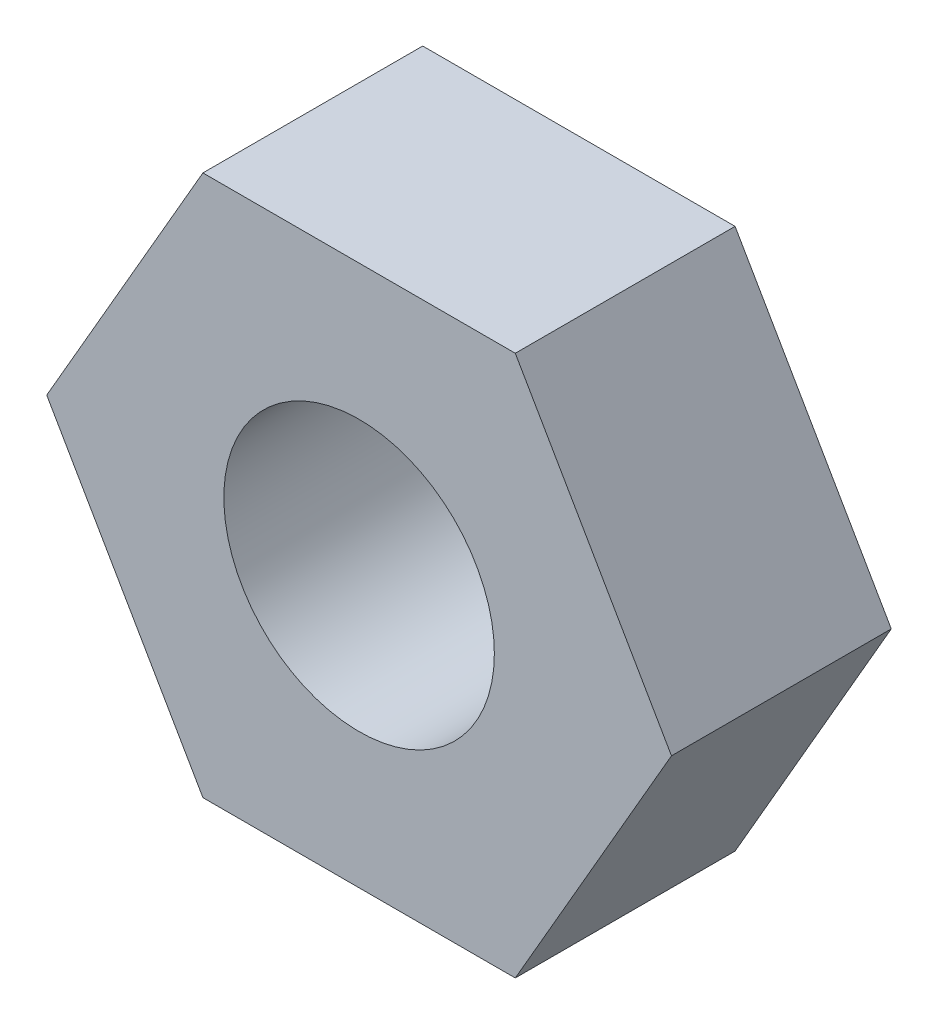
ISO-10303-21;
HEADER;
FILE_DESCRIPTION(('STEP AP214'),'2;1');
FILE_NAME('part.step','',(''),(''),'','','');
FILE_SCHEMA(('AUTOMOTIVE_DESIGN { 1 0 10303 214 1 1 1 1 }'));
ENDSEC;
DATA;
#1=APPLICATION_CONTEXT('core data for automotive mechanical design processes');
#2=APPLICATION_PROTOCOL_DEFINITION('international standard','automotive_design',2000,#1);
#3=PRODUCT_CONTEXT('',#1,'mechanical');
#4=PRODUCT('Part','Part','',(#3));
#5=PRODUCT_RELATED_PRODUCT_CATEGORY('part','',(#4));
#6=PRODUCT_DEFINITION_FORMATION('','',#4);
#7=PRODUCT_DEFINITION_CONTEXT('part definition',#1,'design');
#8=PRODUCT_DEFINITION('design','',#6,#7);
#9=PRODUCT_DEFINITION_SHAPE('','',#8);
#10=(LENGTH_UNIT() NAMED_UNIT(*) SI_UNIT(.MILLI.,.METRE.));
#11=(NAMED_UNIT(*) PLANE_ANGLE_UNIT() SI_UNIT($,.RADIAN.));
#12=(NAMED_UNIT(*) SI_UNIT($,.STERADIAN.) SOLID_ANGLE_UNIT());
#13=UNCERTAINTY_MEASURE_WITH_UNIT(LENGTH_MEASURE(1.E-05),#10,'distance_accuracy_value','');
#14=(GEOMETRIC_REPRESENTATION_CONTEXT(3) GLOBAL_UNCERTAINTY_ASSIGNED_CONTEXT((#13)) GLOBAL_UNIT_ASSIGNED_CONTEXT((#10,
#11,#12)) REPRESENTATION_CONTEXT('',''));
#15=CARTESIAN_POINT('',(0.,0.,0.));
#16=DIRECTION('',(0.,0.,1.));
#17=DIRECTION('',(1.,0.,0.));
#18=AXIS2_PLACEMENT_3D('',#15,#16,#17);
#19=CARTESIAN_POINT('',(0.,0.,1.3));
#20=DIRECTION('',(0.,0.,1.));
#21=DIRECTION('',(1.,0.,0.));
#22=AXIS2_PLACEMENT_3D('',#19,#20,#21);
#23=PLANE('',#22);
#24=DIRECTION('',(0.5,0.866025403784439,0.));
#25=VECTOR('',#24,1.);
#26=CARTESIAN_POINT('',(0.923760430703402,-1.6,1.3));
#27=LINE('',#26,#25);
#28=CARTESIAN_POINT('',(0.923760430703402,-1.6,1.3));
#29=VERTEX_POINT('',#28);
#30=CARTESIAN_POINT('',(1.8475208614068,0.,1.3));
#31=VERTEX_POINT('',#30);
#32=EDGE_CURVE('E137',#29,#31,#27,.T.);
#33=ORIENTED_EDGE('',*,*,#32,.T.);
#34=DIRECTION('',(-0.5,0.866025403784439,0.));
#35=VECTOR('',#34,1.);
#36=CARTESIAN_POINT('',(1.8475208614068,0.,1.3));
#37=LINE('',#36,#35);
#38=CARTESIAN_POINT('',(0.923760430703402,1.6,1.3));
#39=VERTEX_POINT('',#38);
#40=EDGE_CURVE('E95',#31,#39,#37,.T.);
#41=ORIENTED_EDGE('',*,*,#40,.T.);
#42=DIRECTION('',(-1.,0.,0.));
#43=VECTOR('',#42,1.);
#44=CARTESIAN_POINT('',(0.923760430703402,1.6,1.3));
#45=LINE('',#44,#43);
#46=CARTESIAN_POINT('',(-0.923760430703401,1.6,1.3));
#47=VERTEX_POINT('',#46);
#48=EDGE_CURVE('E108',#39,#47,#45,.T.);
#49=ORIENTED_EDGE('',*,*,#48,.T.);
#50=DIRECTION('',(-0.5,-0.866025403784438,0.));
#51=VECTOR('',#50,1.);
#52=CARTESIAN_POINT('',(-0.923760430703401,1.6,1.3));
#53=LINE('',#52,#51);
#54=CARTESIAN_POINT('',(-1.8475208614068,0.,1.3));
#55=VERTEX_POINT('',#54);
#56=EDGE_CURVE('E105',#47,#55,#53,.T.);
#57=ORIENTED_EDGE('',*,*,#56,.T.);
#58=DIRECTION('',(0.5,-0.866025403784439,0.));
#59=VECTOR('',#58,1.);
#60=CARTESIAN_POINT('',(-1.8475208614068,0.,1.3));
#61=LINE('',#60,#59);
#62=CARTESIAN_POINT('',(-0.923760430703402,-1.6,1.3));
#63=VERTEX_POINT('',#62);
#64=EDGE_CURVE('E106',#55,#63,#61,.T.);
#65=ORIENTED_EDGE('',*,*,#64,.T.);
#66=DIRECTION('',(1.,0.,0.));
#67=VECTOR('',#66,1.);
#68=CARTESIAN_POINT('',(-0.923760430703402,-1.6,1.3));
#69=LINE('',#68,#67);
#70=EDGE_CURVE('E59',#63,#29,#69,.T.);
#71=ORIENTED_EDGE('',*,*,#70,.T.);
#72=EDGE_LOOP('',(#33,#41,#49,#57,#65,#71));
#73=FACE_BOUND('',#72,.T.);
#74=CARTESIAN_POINT('',(0.,0.,1.3));
#75=DIRECTION('',(0.,0.,1.));
#76=DIRECTION('',(1.,0.,0.));
#77=AXIS2_PLACEMENT_3D('',#74,#75,#76);
#78=CIRCLE('',#77,0.8);
#79=CARTESIAN_POINT('',(0.8,0.,1.3));
#80=VERTEX_POINT('',#79);
#81=EDGE_CURVE('E127',#80,#80,#78,.T.);
#82=ORIENTED_EDGE('',*,*,#81,.F.);
#83=EDGE_LOOP('',(#82));
#84=FACE_BOUND('',#83,.T.);
#85=ADVANCED_FACE('F41',(#73,#84),#23,.T.);
#86=CARTESIAN_POINT('',(0.,0.,0.));
#87=DIRECTION('',(0.,0.,1.));
#88=DIRECTION('',(1.,0.,0.));
#89=AXIS2_PLACEMENT_3D('',#86,#87,#88);
#90=PLANE('',#89);
#91=DIRECTION('',(0.5,0.866025403784439,0.));
#92=VECTOR('',#91,1.);
#93=CARTESIAN_POINT('',(0.923760430703402,-1.6,0.));
#94=LINE('',#93,#92);
#95=CARTESIAN_POINT('',(0.923760430703402,-1.6,0.));
#96=VERTEX_POINT('',#95);
#97=CARTESIAN_POINT('',(1.8475208614068,0.,0.));
#98=VERTEX_POINT('',#97);
#99=EDGE_CURVE('E129',#96,#98,#94,.T.);
#100=ORIENTED_EDGE('',*,*,#99,.F.);
#101=DIRECTION('',(1.,0.,0.));
#102=VECTOR('',#101,1.);
#103=CARTESIAN_POINT('',(-0.923760430703402,-1.6,0.));
#104=LINE('',#103,#102);
#105=CARTESIAN_POINT('',(-0.923760430703402,-1.6,0.));
#106=VERTEX_POINT('',#105);
#107=EDGE_CURVE('E90',#106,#96,#104,.T.);
#108=ORIENTED_EDGE('',*,*,#107,.F.);
#109=DIRECTION('',(0.5,-0.866025403784439,0.));
#110=VECTOR('',#109,1.);
#111=CARTESIAN_POINT('',(-1.8475208614068,0.,0.));
#112=LINE('',#111,#110);
#113=CARTESIAN_POINT('',(-1.8475208614068,0.,0.));
#114=VERTEX_POINT('',#113);
#115=EDGE_CURVE('E84',#114,#106,#112,.T.);
#116=ORIENTED_EDGE('',*,*,#115,.F.);
#117=DIRECTION('',(-0.5,-0.866025403784438,0.));
#118=VECTOR('',#117,1.);
#119=CARTESIAN_POINT('',(-0.923760430703401,1.6,0.));
#120=LINE('',#119,#118);
#121=CARTESIAN_POINT('',(-0.923760430703401,1.6,0.));
#122=VERTEX_POINT('',#121);
#123=EDGE_CURVE('E116',#122,#114,#120,.T.);
#124=ORIENTED_EDGE('',*,*,#123,.F.);
#125=DIRECTION('',(-1.,0.,0.));
#126=VECTOR('',#125,1.);
#127=CARTESIAN_POINT('',(0.923760430703402,1.6,0.));
#128=LINE('',#127,#126);
#129=CARTESIAN_POINT('',(0.923760430703402,1.6,0.));
#130=VERTEX_POINT('',#129);
#131=EDGE_CURVE('E135',#130,#122,#128,.T.);
#132=ORIENTED_EDGE('',*,*,#131,.F.);
#133=DIRECTION('',(-0.5,0.866025403784439,0.));
#134=VECTOR('',#133,1.);
#135=CARTESIAN_POINT('',(1.8475208614068,0.,0.));
#136=LINE('',#135,#134);
#137=EDGE_CURVE('E128',#98,#130,#136,.T.);
#138=ORIENTED_EDGE('',*,*,#137,.F.);
#139=EDGE_LOOP('',(#100,#108,#116,#124,#132,#138));
#140=FACE_BOUND('',#139,.T.);
#141=CARTESIAN_POINT('',(0.,0.,0.));
#142=DIRECTION('',(0.,0.,1.));
#143=DIRECTION('',(1.,0.,0.));
#144=AXIS2_PLACEMENT_3D('',#141,#142,#143);
#145=CIRCLE('',#144,0.8);
#146=CARTESIAN_POINT('',(0.8,0.,0.));
#147=VERTEX_POINT('',#146);
#148=EDGE_CURVE('E229',#147,#147,#145,.T.);
#149=ORIENTED_EDGE('',*,*,#148,.T.);
#150=EDGE_LOOP('',(#149));
#151=FACE_BOUND('',#150,.T.);
#152=ADVANCED_FACE('F149',(#140,#151),#90,.F.);
#153=CARTESIAN_POINT('',(0.923760430703402,-1.6,1.3));
#154=DIRECTION('',(-0.866025403784439,0.5,0.));
#155=DIRECTION('',(-0.5,-0.866025403784439,0.));
#156=AXIS2_PLACEMENT_3D('',#153,#154,#155);
#157=PLANE('',#156);
#158=ORIENTED_EDGE('',*,*,#99,.T.);
#159=DIRECTION('',(0.,0.,-1.));
#160=VECTOR('',#159,1.);
#161=CARTESIAN_POINT('',(1.8475208614068,0.,1.3));
#162=LINE('',#161,#160);
#163=EDGE_CURVE('E11',#31,#98,#162,.T.);
#164=ORIENTED_EDGE('',*,*,#163,.F.);
#165=ORIENTED_EDGE('',*,*,#32,.F.);
#166=DIRECTION('',(0.,0.,-1.));
#167=VECTOR('',#166,1.);
#168=CARTESIAN_POINT('',(0.923760430703402,-1.6,1.3));
#169=LINE('',#168,#167);
#170=EDGE_CURVE('E125',#29,#96,#169,.T.);
#171=ORIENTED_EDGE('',*,*,#170,.T.);
#172=EDGE_LOOP('',(#158,#164,#165,#171));
#173=FACE_BOUND('',#172,.T.);
#174=ADVANCED_FACE('F43',(#173),#157,.F.);
#175=CARTESIAN_POINT('',(1.8475208614068,0.,1.3));
#176=DIRECTION('',(-0.866025403784439,-0.5,0.));
#177=DIRECTION('',(0.5,-0.866025403784439,0.));
#178=AXIS2_PLACEMENT_3D('',#175,#176,#177);
#179=PLANE('',#178);
#180=ORIENTED_EDGE('',*,*,#137,.T.);
#181=DIRECTION('',(0.,0.,-1.));
#182=VECTOR('',#181,1.);
#183=CARTESIAN_POINT('',(0.923760430703402,1.6,1.3));
#184=LINE('',#183,#182);
#185=EDGE_CURVE('E49',#39,#130,#184,.T.);
#186=ORIENTED_EDGE('',*,*,#185,.F.);
#187=ORIENTED_EDGE('',*,*,#40,.F.);
#188=ORIENTED_EDGE('',*,*,#163,.T.);
#189=EDGE_LOOP('',(#180,#186,#187,#188));
#190=FACE_BOUND('',#189,.T.);
#191=ADVANCED_FACE('F171',(#190),#179,.F.);
#192=CARTESIAN_POINT('',(0.923760430703402,1.6,1.3));
#193=DIRECTION('',(0.,-1.,0.));
#194=DIRECTION('',(1.,0.,0.));
#195=AXIS2_PLACEMENT_3D('',#192,#193,#194);
#196=PLANE('',#195);
#197=ORIENTED_EDGE('',*,*,#131,.T.);
#198=DIRECTION('',(0.,0.,-1.));
#199=VECTOR('',#198,1.);
#200=CARTESIAN_POINT('',(-0.923760430703401,1.6,1.3));
#201=LINE('',#200,#199);
#202=EDGE_CURVE('E120',#47,#122,#201,.T.);
#203=ORIENTED_EDGE('',*,*,#202,.F.);
#204=ORIENTED_EDGE('',*,*,#48,.F.);
#205=ORIENTED_EDGE('',*,*,#185,.T.);
#206=EDGE_LOOP('',(#197,#203,#204,#205));
#207=FACE_BOUND('',#206,.T.);
#208=ADVANCED_FACE('F141',(#207),#196,.F.);
#209=CARTESIAN_POINT('',(-0.923760430703401,1.6,1.3));
#210=DIRECTION('',(0.866025403784439,-0.5,0.));
#211=DIRECTION('',(0.5,0.866025403784439,0.));
#212=AXIS2_PLACEMENT_3D('',#209,#210,#211);
#213=PLANE('',#212);
#214=ORIENTED_EDGE('',*,*,#123,.T.);
#215=DIRECTION('',(0.,0.,-1.));
#216=VECTOR('',#215,1.);
#217=CARTESIAN_POINT('',(-1.8475208614068,0.,1.3));
#218=LINE('',#217,#216);
#219=EDGE_CURVE('E113',#55,#114,#218,.T.);
#220=ORIENTED_EDGE('',*,*,#219,.F.);
#221=ORIENTED_EDGE('',*,*,#56,.F.);
#222=ORIENTED_EDGE('',*,*,#202,.T.);
#223=EDGE_LOOP('',(#214,#220,#221,#222));
#224=FACE_BOUND('',#223,.T.);
#225=ADVANCED_FACE('F112',(#224),#213,.F.);
#226=CARTESIAN_POINT('',(-1.8475208614068,0.,1.3));
#227=DIRECTION('',(0.866025403784439,0.5,0.));
#228=DIRECTION('',(-0.5,0.866025403784439,0.));
#229=AXIS2_PLACEMENT_3D('',#226,#227,#228);
#230=PLANE('',#229);
#231=ORIENTED_EDGE('',*,*,#115,.T.);
#232=DIRECTION('',(0.,0.,-1.));
#233=VECTOR('',#232,1.);
#234=CARTESIAN_POINT('',(-0.923760430703402,-1.6,1.3));
#235=LINE('',#234,#233);
#236=EDGE_CURVE('E117',#63,#106,#235,.T.);
#237=ORIENTED_EDGE('',*,*,#236,.F.);
#238=ORIENTED_EDGE('',*,*,#64,.F.);
#239=ORIENTED_EDGE('',*,*,#219,.T.);
#240=EDGE_LOOP('',(#231,#237,#238,#239));
#241=FACE_BOUND('',#240,.T.);
#242=ADVANCED_FACE('F119',(#241),#230,.F.);
#243=CARTESIAN_POINT('',(-0.923760430703402,-1.6,1.3));
#244=DIRECTION('',(0.,1.,0.));
#245=DIRECTION('',(-1.,0.,0.));
#246=AXIS2_PLACEMENT_3D('',#243,#244,#245);
#247=PLANE('',#246);
#248=ORIENTED_EDGE('',*,*,#107,.T.);
#249=ORIENTED_EDGE('',*,*,#170,.F.);
#250=ORIENTED_EDGE('',*,*,#70,.F.);
#251=ORIENTED_EDGE('',*,*,#236,.T.);
#252=EDGE_LOOP('',(#248,#249,#250,#251));
#253=FACE_BOUND('',#252,.T.);
#254=ADVANCED_FACE('F151',(#253),#247,.F.);
#255=CARTESIAN_POINT('',(0.,0.,1.3));
#256=DIRECTION('',(0.,0.,-1.));
#257=DIRECTION('',(-1.,0.,0.));
#258=AXIS2_PLACEMENT_3D('',#255,#256,#257);
#259=CYLINDRICAL_SURFACE('',#258,0.8);
#260=ORIENTED_EDGE('',*,*,#81,.T.);
#261=EDGE_LOOP('',(#260));
#262=FACE_BOUND('',#261,.T.);
#263=ORIENTED_EDGE('',*,*,#148,.F.);
#264=EDGE_LOOP('',(#263));
#265=FACE_BOUND('',#264,.T.);
#266=ADVANCED_FACE('F152',(#262,#265),#259,.F.);
#267=CLOSED_SHELL('',(#85,#152,#174,#191,#208,#225,#242,#254,#266));
#268=MANIFOLD_SOLID_BREP('B2',#267);
#269=ADVANCED_BREP_SHAPE_REPRESENTATION('',(#18,#268),#14);
#270=SHAPE_DEFINITION_REPRESENTATION(#9,#269);
ENDSEC;
END-ISO-10303-21;
